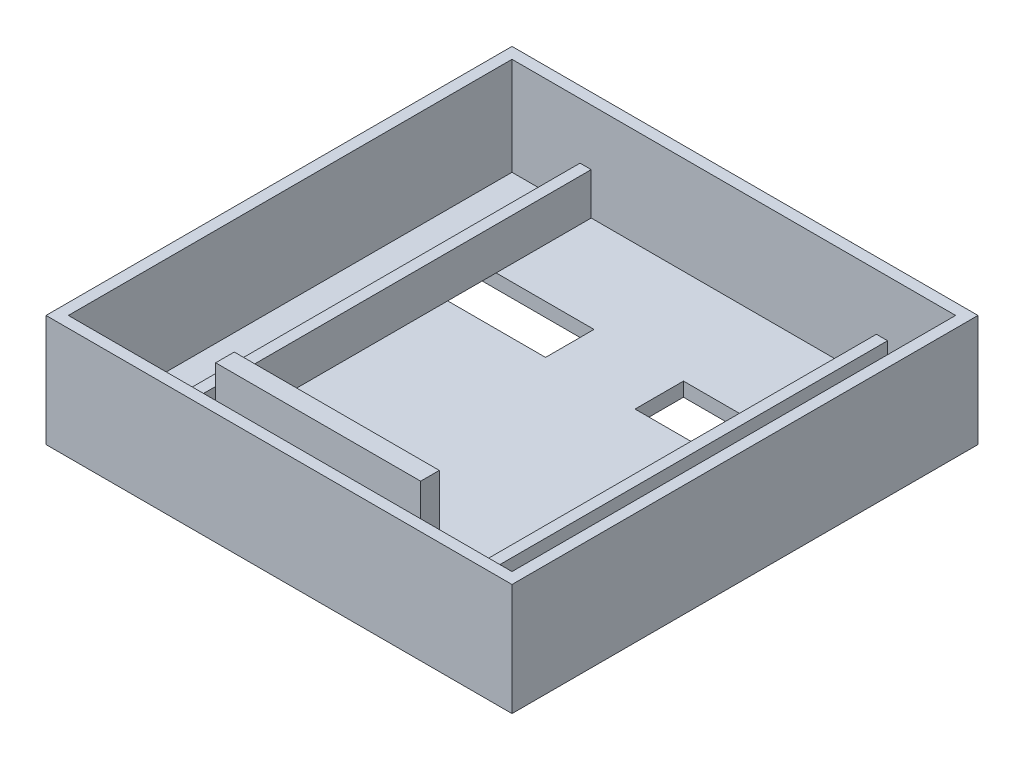
ISO-10303-21;
HEADER;
FILE_DESCRIPTION(('STEP AP214'),'2;1');
FILE_NAME('part.step','',(''),(''),'','','');
FILE_SCHEMA(('AUTOMOTIVE_DESIGN { 1 0 10303 214 1 1 1 1 }'));
ENDSEC;
DATA;
#1=APPLICATION_CONTEXT('core data for automotive mechanical design processes');
#2=APPLICATION_PROTOCOL_DEFINITION('international standard','automotive_design',2000,#1);
#3=PRODUCT_CONTEXT('',#1,'mechanical');
#4=PRODUCT('Part','Part','',(#3));
#5=PRODUCT_RELATED_PRODUCT_CATEGORY('part','',(#4));
#6=PRODUCT_DEFINITION_FORMATION('','',#4);
#7=PRODUCT_DEFINITION_CONTEXT('part definition',#1,'design');
#8=PRODUCT_DEFINITION('design','',#6,#7);
#9=PRODUCT_DEFINITION_SHAPE('','',#8);
#10=(LENGTH_UNIT() NAMED_UNIT(*) SI_UNIT(.MILLI.,.METRE.));
#11=(NAMED_UNIT(*) PLANE_ANGLE_UNIT() SI_UNIT($,.RADIAN.));
#12=(NAMED_UNIT(*) SI_UNIT($,.STERADIAN.) SOLID_ANGLE_UNIT());
#13=UNCERTAINTY_MEASURE_WITH_UNIT(LENGTH_MEASURE(1.E-05),#10,'distance_accuracy_value','');
#14=(GEOMETRIC_REPRESENTATION_CONTEXT(3) GLOBAL_UNCERTAINTY_ASSIGNED_CONTEXT((#13)) GLOBAL_UNIT_ASSIGNED_CONTEXT((#10,
#11,#12)) REPRESENTATION_CONTEXT('',''));
#15=CARTESIAN_POINT('',(0.,0.,0.));
#16=DIRECTION('',(0.,0.,1.));
#17=DIRECTION('',(1.,0.,0.));
#18=AXIS2_PLACEMENT_3D('',#15,#16,#17);
#19=CARTESIAN_POINT('',(2.4,13.,-8.4));
#20=DIRECTION('',(0.,0.,1.));
#21=DIRECTION('',(1.,0.,0.));
#22=AXIS2_PLACEMENT_3D('',#19,#20,#21);
#23=PLANE('',#22);
#24=DIRECTION('',(0.,-1.,0.));
#25=VECTOR('',#24,1.);
#26=CARTESIAN_POINT('',(72.,25.,-8.4));
#27=LINE('',#26,#25);
#28=CARTESIAN_POINT('',(72.,13.,-8.4));
#29=VERTEX_POINT('',#28);
#30=CARTESIAN_POINT('',(72.,3.,-8.4));
#31=VERTEX_POINT('',#30);
#32=EDGE_CURVE('E68',#29,#31,#27,.T.);
#33=ORIENTED_EDGE('',*,*,#32,.F.);
#34=DIRECTION('',(-1.,0.,0.));
#35=VECTOR('',#34,1.);
#36=CARTESIAN_POINT('',(2.4,13.,-8.4));
#37=LINE('',#36,#35);
#38=CARTESIAN_POINT('',(97.6,13.,-8.4));
#39=VERTEX_POINT('',#38);
#40=EDGE_CURVE('E327',#39,#29,#37,.T.);
#41=ORIENTED_EDGE('',*,*,#40,.F.);
#42=DIRECTION('',(0.,-1.,0.));
#43=VECTOR('',#42,1.);
#44=CARTESIAN_POINT('',(97.6,13.,-8.4));
#45=LINE('',#44,#43);
#46=CARTESIAN_POINT('',(97.6,3.,-8.4));
#47=VERTEX_POINT('',#46);
#48=EDGE_CURVE('E340',#39,#47,#45,.T.);
#49=ORIENTED_EDGE('',*,*,#48,.T.);
#50=DIRECTION('',(-1.,0.,0.));
#51=VECTOR('',#50,1.);
#52=CARTESIAN_POINT('',(2.4,3.,-8.4));
#53=LINE('',#52,#51);
#54=CARTESIAN_POINT('',(83.,3.,-8.4));
#55=VERTEX_POINT('',#54);
#56=EDGE_CURVE('E319',#47,#55,#53,.T.);
#57=ORIENTED_EDGE('',*,*,#56,.T.);
#58=DIRECTION('',(0.,1.,0.));
#59=VECTOR('',#58,1.);
#60=CARTESIAN_POINT('',(83.,12.,-8.4));
#61=LINE('',#60,#59);
#62=CARTESIAN_POINT('',(83.,12.,-8.4));
#63=VERTEX_POINT('',#62);
#64=EDGE_CURVE('E355',#55,#63,#61,.T.);
#65=ORIENTED_EDGE('',*,*,#64,.T.);
#66=DIRECTION('',(-1.,0.,0.));
#67=VECTOR('',#66,1.);
#68=CARTESIAN_POINT('',(0.,12.,-8.4));
#69=LINE('',#68,#67);
#70=CARTESIAN_POINT('',(80.6,12.,-8.4));
#71=VERTEX_POINT('',#70);
#72=EDGE_CURVE('E349',#63,#71,#69,.T.);
#73=ORIENTED_EDGE('',*,*,#72,.T.);
#74=DIRECTION('',(0.,-1.,0.));
#75=VECTOR('',#74,1.);
#76=CARTESIAN_POINT('',(80.6,12.,-8.4));
#77=LINE('',#76,#75);
#78=CARTESIAN_POINT('',(80.6,3.,-8.4));
#79=VERTEX_POINT('',#78);
#80=EDGE_CURVE('E360',#71,#79,#77,.T.);
#81=ORIENTED_EDGE('',*,*,#80,.T.);
#82=EDGE_CURVE('E313',#79,#31,#53,.T.);
#83=ORIENTED_EDGE('',*,*,#82,.T.);
#84=EDGE_LOOP('',(#33,#41,#49,#57,#65,#73,#81,#83));
#85=FACE_BOUND('',#84,.T.);
#86=ADVANCED_FACE('F44',(#85),#23,.F.);
#87=CARTESIAN_POINT('',(0.,3.,0.));
#88=DIRECTION('',(0.,-1.,0.));
#89=DIRECTION('',(0.,0.,-1.));
#90=AXIS2_PLACEMENT_3D('',#87,#88,#89);
#91=PLANE('',#90);
#92=DIRECTION('',(0.,0.,1.));
#93=VECTOR('',#92,1.);
#94=CARTESIAN_POINT('',(28.,3.,-8.4));
#95=LINE('',#94,#93);
#96=CARTESIAN_POINT('',(28.,3.,-12.4));
#97=VERTEX_POINT('',#96);
#98=CARTESIAN_POINT('',(28.,3.,-8.4));
#99=VERTEX_POINT('',#98);
#100=EDGE_CURVE('E725',#97,#99,#95,.T.);
#101=ORIENTED_EDGE('',*,*,#100,.F.);
#102=DIRECTION('',(-1.,0.,0.));
#103=VECTOR('',#102,1.);
#104=CARTESIAN_POINT('',(28.,3.,-12.4));
#105=LINE('',#104,#103);
#106=CARTESIAN_POINT('',(72.,3.,-12.4));
#107=VERTEX_POINT('',#106);
#108=EDGE_CURVE('E296',#107,#97,#105,.T.);
#109=ORIENTED_EDGE('',*,*,#108,.F.);
#110=DIRECTION('',(0.,0.,-1.));
#111=VECTOR('',#110,1.);
#112=CARTESIAN_POINT('',(72.,3.,-8.4));
#113=LINE('',#112,#111);
#114=EDGE_CURVE('E706',#31,#107,#113,.T.);
#115=ORIENTED_EDGE('',*,*,#114,.F.);
#116=ORIENTED_EDGE('',*,*,#82,.F.);
#117=DIRECTION('',(0.,0.,1.));
#118=VECTOR('',#117,1.);
#119=CARTESIAN_POINT('',(80.6,3.,-2.4));
#120=LINE('',#119,#118);
#121=CARTESIAN_POINT('',(80.6,3.,-66.7999999999999));
#122=VERTEX_POINT('',#121);
#123=EDGE_CURVE('E409',#122,#79,#120,.T.);
#124=ORIENTED_EDGE('',*,*,#123,.F.);
#125=DIRECTION('',(-1.,0.,0.));
#126=VECTOR('',#125,1.);
#127=CARTESIAN_POINT('',(0.,3.,-66.8));
#128=LINE('',#127,#126);
#129=CARTESIAN_POINT('',(59.6,3.,-66.8));
#130=VERTEX_POINT('',#129);
#131=EDGE_CURVE('E559',#122,#130,#128,.T.);
#132=ORIENTED_EDGE('',*,*,#131,.T.);
#133=DIRECTION('',(0.,0.,-1.));
#134=VECTOR('',#133,1.);
#135=CARTESIAN_POINT('',(59.6,3.,0.));
#136=LINE('',#135,#134);
#137=CARTESIAN_POINT('',(59.6,3.,-77.2));
#138=VERTEX_POINT('',#137);
#139=EDGE_CURVE('E572',#130,#138,#136,.T.);
#140=ORIENTED_EDGE('',*,*,#139,.T.);
#141=DIRECTION('',(1.,0.,0.));
#142=VECTOR('',#141,1.);
#143=CARTESIAN_POINT('',(0.,3.,-77.2));
#144=LINE('',#143,#142);
#145=CARTESIAN_POINT('',(80.6,3.,-77.1999999999999));
#146=VERTEX_POINT('',#145);
#147=EDGE_CURVE('E574',#138,#146,#144,.T.);
#148=ORIENTED_EDGE('',*,*,#147,.T.);
#149=CARTESIAN_POINT('',(80.6,3.,-97.6));
#150=VERTEX_POINT('',#149);
#151=EDGE_CURVE('E405',#150,#146,#120,.T.);
#152=ORIENTED_EDGE('',*,*,#151,.F.);
#153=DIRECTION('',(-1.,0.,0.));
#154=VECTOR('',#153,1.);
#155=CARTESIAN_POINT('',(2.4,3.,-97.6));
#156=LINE('',#155,#154);
#157=CARTESIAN_POINT('',(19.4,3.,-97.6));
#158=VERTEX_POINT('',#157);
#159=EDGE_CURVE('E496',#150,#158,#156,.T.);
#160=ORIENTED_EDGE('',*,*,#159,.T.);
#161=DIRECTION('',(0.,0.,-1.));
#162=VECTOR('',#161,1.);
#163=CARTESIAN_POINT('',(19.4,3.,-2.4));
#164=LINE('',#163,#162);
#165=CARTESIAN_POINT('',(19.4,3.,-77.1999999999999));
#166=VERTEX_POINT('',#165);
#167=EDGE_CURVE('E381',#166,#158,#164,.T.);
#168=ORIENTED_EDGE('',*,*,#167,.F.);
#169=DIRECTION('',(1.,0.,0.));
#170=VECTOR('',#169,1.);
#171=CARTESIAN_POINT('',(0.,3.,-77.2));
#172=LINE('',#171,#170);
#173=CARTESIAN_POINT('',(40.4,3.,-77.2));
#174=VERTEX_POINT('',#173);
#175=EDGE_CURVE('E587',#166,#174,#172,.T.);
#176=ORIENTED_EDGE('',*,*,#175,.T.);
#177=DIRECTION('',(0.,0.,1.));
#178=VECTOR('',#177,1.);
#179=CARTESIAN_POINT('',(40.4,3.,0.));
#180=LINE('',#179,#178);
#181=CARTESIAN_POINT('',(40.4,3.,-66.8));
#182=VERTEX_POINT('',#181);
#183=EDGE_CURVE('E584',#174,#182,#180,.T.);
#184=ORIENTED_EDGE('',*,*,#183,.T.);
#185=DIRECTION('',(-1.,0.,0.));
#186=VECTOR('',#185,1.);
#187=CARTESIAN_POINT('',(0.,3.,-66.8));
#188=LINE('',#187,#186);
#189=CARTESIAN_POINT('',(19.4,3.,-66.7999999999999));
#190=VERTEX_POINT('',#189);
#191=EDGE_CURVE('E583',#182,#190,#188,.T.);
#192=ORIENTED_EDGE('',*,*,#191,.T.);
#193=CARTESIAN_POINT('',(19.4,3.,-8.4));
#194=VERTEX_POINT('',#193);
#195=EDGE_CURVE('E368',#194,#190,#164,.T.);
#196=ORIENTED_EDGE('',*,*,#195,.F.);
#197=EDGE_CURVE('E310',#99,#194,#53,.T.);
#198=ORIENTED_EDGE('',*,*,#197,.F.);
#199=EDGE_LOOP('',(#101,#109,#115,#116,#124,#132,#140,#148,#152,#160,#168,#176,#184,#192,#196,#198));
#200=FACE_BOUND('',#199,.T.);
#201=ADVANCED_FACE('F638',(#200),#91,.F.);
#202=CARTESIAN_POINT('',(17.,3.,-8.4));
#203=VERTEX_POINT('',#202);
#204=CARTESIAN_POINT('',(2.4,3.,-8.4));
#205=VERTEX_POINT('',#204);
#206=EDGE_CURVE('E304',#203,#205,#53,.T.);
#207=ORIENTED_EDGE('',*,*,#206,.F.);
#208=DIRECTION('',(0.,0.,1.));
#209=VECTOR('',#208,1.);
#210=CARTESIAN_POINT('',(17.,3.,-2.4));
#211=LINE('',#210,#209);
#212=CARTESIAN_POINT('',(17.,3.,-66.7999999999999));
#213=VERTEX_POINT('',#212);
#214=EDGE_CURVE('E53',#213,#203,#211,.T.);
#215=ORIENTED_EDGE('',*,*,#214,.F.);
#216=CARTESIAN_POINT('',(14.,3.,-66.8));
#217=VERTEX_POINT('',#216);
#218=EDGE_CURVE('E577',#213,#217,#188,.T.);
#219=ORIENTED_EDGE('',*,*,#218,.T.);
#220=DIRECTION('',(0.,0.,-1.));
#221=VECTOR('',#220,1.);
#222=CARTESIAN_POINT('',(14.,3.,0.));
#223=LINE('',#222,#221);
#224=CARTESIAN_POINT('',(14.,3.,-77.2));
#225=VERTEX_POINT('',#224);
#226=EDGE_CURVE('E592',#217,#225,#223,.T.);
#227=ORIENTED_EDGE('',*,*,#226,.T.);
#228=CARTESIAN_POINT('',(17.,3.,-77.1999999999999));
#229=VERTEX_POINT('',#228);
#230=EDGE_CURVE('E591',#225,#229,#172,.T.);
#231=ORIENTED_EDGE('',*,*,#230,.T.);
#232=CARTESIAN_POINT('',(17.,3.,-97.6));
#233=VERTEX_POINT('',#232);
#234=EDGE_CURVE('E373',#233,#229,#211,.T.);
#235=ORIENTED_EDGE('',*,*,#234,.F.);
#236=CARTESIAN_POINT('',(2.4,3.,-97.6));
#237=VERTEX_POINT('',#236);
#238=EDGE_CURVE('E494',#233,#237,#156,.T.);
#239=ORIENTED_EDGE('',*,*,#238,.T.);
#240=DIRECTION('',(0.,0.,1.));
#241=VECTOR('',#240,1.);
#242=CARTESIAN_POINT('',(2.4,3.,-2.4));
#243=LINE('',#242,#241);
#244=EDGE_CURVE('E471',#237,#205,#243,.T.);
#245=ORIENTED_EDGE('',*,*,#244,.T.);
#246=EDGE_LOOP('',(#207,#215,#219,#227,#231,#235,#239,#245));
#247=FACE_BOUND('',#246,.T.);
#248=ADVANCED_FACE('F647',(#247),#91,.F.);
#249=ORIENTED_EDGE('',*,*,#56,.F.);
#250=DIRECTION('',(0.,0.,-1.));
#251=VECTOR('',#250,1.);
#252=CARTESIAN_POINT('',(97.6,3.,-2.4));
#253=LINE('',#252,#251);
#254=CARTESIAN_POINT('',(97.6,3.,-97.6));
#255=VERTEX_POINT('',#254);
#256=EDGE_CURVE('E495',#47,#255,#253,.T.);
#257=ORIENTED_EDGE('',*,*,#256,.T.);
#258=CARTESIAN_POINT('',(83.,3.,-97.6));
#259=VERTEX_POINT('',#258);
#260=EDGE_CURVE('E476',#255,#259,#156,.T.);
#261=ORIENTED_EDGE('',*,*,#260,.T.);
#262=DIRECTION('',(0.,0.,-1.));
#263=VECTOR('',#262,1.);
#264=CARTESIAN_POINT('',(83.,3.,-2.4));
#265=LINE('',#264,#263);
#266=CARTESIAN_POINT('',(83.,3.,-77.1999999999999));
#267=VERTEX_POINT('',#266);
#268=EDGE_CURVE('E402',#267,#259,#265,.T.);
#269=ORIENTED_EDGE('',*,*,#268,.F.);
#270=CARTESIAN_POINT('',(86.,3.,-77.2));
#271=VERTEX_POINT('',#270);
#272=EDGE_CURVE('E568',#267,#271,#144,.T.);
#273=ORIENTED_EDGE('',*,*,#272,.T.);
#274=DIRECTION('',(0.,0.,1.));
#275=VECTOR('',#274,1.);
#276=CARTESIAN_POINT('',(86.,3.,0.));
#277=LINE('',#276,#275);
#278=CARTESIAN_POINT('',(86.,3.,-66.8));
#279=VERTEX_POINT('',#278);
#280=EDGE_CURVE('E562',#271,#279,#277,.T.);
#281=ORIENTED_EDGE('',*,*,#280,.T.);
#282=CARTESIAN_POINT('',(83.,3.,-66.7999999999999));
#283=VERTEX_POINT('',#282);
#284=EDGE_CURVE('E564',#279,#283,#128,.T.);
#285=ORIENTED_EDGE('',*,*,#284,.T.);
#286=EDGE_CURVE('E399',#55,#283,#265,.T.);
#287=ORIENTED_EDGE('',*,*,#286,.F.);
#288=EDGE_LOOP('',(#249,#257,#261,#269,#273,#281,#285,#287));
#289=FACE_BOUND('',#288,.T.);
#290=ADVANCED_FACE('F614',(#289),#91,.F.);
#291=CARTESIAN_POINT('',(80.6,12.,-2.4));
#292=DIRECTION('',(1.,0.,0.));
#293=DIRECTION('',(0.,0.,-1.));
#294=AXIS2_PLACEMENT_3D('',#291,#292,#293);
#295=PLANE('',#294);
#296=ORIENTED_EDGE('',*,*,#80,.F.);
#297=DIRECTION('',(0.,0.,1.));
#298=VECTOR('',#297,1.);
#299=CARTESIAN_POINT('',(80.6,12.,-2.4));
#300=LINE('',#299,#298);
#301=CARTESIAN_POINT('',(80.6,12.,-97.6));
#302=VERTEX_POINT('',#301);
#303=EDGE_CURVE('E415',#302,#71,#300,.T.);
#304=ORIENTED_EDGE('',*,*,#303,.F.);
#305=DIRECTION('',(0.,-1.,0.));
#306=VECTOR('',#305,1.);
#307=CARTESIAN_POINT('',(80.6,12.,-97.6));
#308=LINE('',#307,#306);
#309=EDGE_CURVE('E395',#302,#150,#308,.T.);
#310=ORIENTED_EDGE('',*,*,#309,.T.);
#311=ORIENTED_EDGE('',*,*,#151,.T.);
#312=EDGE_CURVE('E398',#146,#122,#120,.T.);
#313=ORIENTED_EDGE('',*,*,#312,.T.);
#314=ORIENTED_EDGE('',*,*,#123,.T.);
#315=EDGE_LOOP('',(#296,#304,#310,#311,#313,#314));
#316=FACE_BOUND('',#315,.T.);
#317=ADVANCED_FACE('F627',(#316),#295,.F.);
#318=CARTESIAN_POINT('',(83.,12.,-2.4));
#319=DIRECTION('',(-1.,0.,0.));
#320=DIRECTION('',(0.,0.,1.));
#321=AXIS2_PLACEMENT_3D('',#318,#319,#320);
#322=PLANE('',#321);
#323=ORIENTED_EDGE('',*,*,#64,.F.);
#324=ORIENTED_EDGE('',*,*,#286,.T.);
#325=EDGE_CURVE('E397',#283,#267,#265,.T.);
#326=ORIENTED_EDGE('',*,*,#325,.T.);
#327=ORIENTED_EDGE('',*,*,#268,.T.);
#328=DIRECTION('',(0.,-1.,0.));
#329=VECTOR('',#328,1.);
#330=CARTESIAN_POINT('',(83.,12.,-97.6));
#331=LINE('',#330,#329);
#332=CARTESIAN_POINT('',(83.,12.,-97.6));
#333=VERTEX_POINT('',#332);
#334=EDGE_CURVE('E363',#333,#259,#331,.T.);
#335=ORIENTED_EDGE('',*,*,#334,.F.);
#336=DIRECTION('',(0.,0.,-1.));
#337=VECTOR('',#336,1.);
#338=CARTESIAN_POINT('',(83.,12.,-2.4));
#339=LINE('',#338,#337);
#340=EDGE_CURVE('E408',#63,#333,#339,.T.);
#341=ORIENTED_EDGE('',*,*,#340,.F.);
#342=EDGE_LOOP('',(#323,#324,#326,#327,#335,#341));
#343=FACE_BOUND('',#342,.T.);
#344=ADVANCED_FACE('F606',(#343),#322,.F.);
#345=CARTESIAN_POINT('',(0.,12.,0.));
#346=DIRECTION('',(0.,-1.,0.));
#347=DIRECTION('',(0.,0.,-1.));
#348=AXIS2_PLACEMENT_3D('',#345,#346,#347);
#349=PLANE('',#348);
#350=ORIENTED_EDGE('',*,*,#72,.F.);
#351=ORIENTED_EDGE('',*,*,#340,.T.);
#352=DIRECTION('',(-1.,0.,0.));
#353=VECTOR('',#352,1.);
#354=CARTESIAN_POINT('',(80.6,12.,-97.6));
#355=LINE('',#354,#353);
#356=EDGE_CURVE('E394',#333,#302,#355,.T.);
#357=ORIENTED_EDGE('',*,*,#356,.T.);
#358=ORIENTED_EDGE('',*,*,#303,.T.);
#359=EDGE_LOOP('',(#350,#351,#357,#358));
#360=FACE_BOUND('',#359,.T.);
#361=ADVANCED_FACE('F763',(#360),#349,.F.);
#362=CARTESIAN_POINT('',(17.,12.,-2.4));
#363=DIRECTION('',(1.,0.,0.));
#364=DIRECTION('',(0.,0.,-1.));
#365=AXIS2_PLACEMENT_3D('',#362,#363,#364);
#366=PLANE('',#365);
#367=DIRECTION('',(0.,-1.,0.));
#368=VECTOR('',#367,1.);
#369=CARTESIAN_POINT('',(17.,12.,-8.4));
#370=LINE('',#369,#368);
#371=CARTESIAN_POINT('',(17.,12.,-8.4));
#372=VERTEX_POINT('',#371);
#373=EDGE_CURVE('E342',#372,#203,#370,.T.);
#374=ORIENTED_EDGE('',*,*,#373,.F.);
#375=DIRECTION('',(0.,0.,1.));
#376=VECTOR('',#375,1.);
#377=CARTESIAN_POINT('',(17.,12.,-2.4));
#378=LINE('',#377,#376);
#379=CARTESIAN_POINT('',(17.,12.,-97.6));
#380=VERTEX_POINT('',#379);
#381=EDGE_CURVE('E362',#380,#372,#378,.T.);
#382=ORIENTED_EDGE('',*,*,#381,.F.);
#383=DIRECTION('',(0.,-1.,0.));
#384=VECTOR('',#383,1.);
#385=CARTESIAN_POINT('',(17.,12.,-97.6));
#386=LINE('',#385,#384);
#387=EDGE_CURVE('E375',#380,#233,#386,.T.);
#388=ORIENTED_EDGE('',*,*,#387,.T.);
#389=ORIENTED_EDGE('',*,*,#234,.T.);
#390=EDGE_CURVE('E378',#229,#213,#211,.T.);
#391=ORIENTED_EDGE('',*,*,#390,.T.);
#392=ORIENTED_EDGE('',*,*,#214,.T.);
#393=EDGE_LOOP('',(#374,#382,#388,#389,#391,#392));
#394=FACE_BOUND('',#393,.T.);
#395=ADVANCED_FACE('F675',(#394),#366,.F.);
#396=CARTESIAN_POINT('',(19.4,12.,-2.4));
#397=DIRECTION('',(-1.,0.,0.));
#398=DIRECTION('',(0.,0.,1.));
#399=AXIS2_PLACEMENT_3D('',#396,#397,#398);
#400=PLANE('',#399);
#401=DIRECTION('',(0.,1.,0.));
#402=VECTOR('',#401,1.);
#403=CARTESIAN_POINT('',(19.4,12.,-8.4));
#404=LINE('',#403,#402);
#405=CARTESIAN_POINT('',(19.4,12.,-8.4));
#406=VERTEX_POINT('',#405);
#407=EDGE_CURVE('E344',#194,#406,#404,.T.);
#408=ORIENTED_EDGE('',*,*,#407,.F.);
#409=ORIENTED_EDGE('',*,*,#195,.T.);
#410=EDGE_CURVE('E380',#190,#166,#164,.T.);
#411=ORIENTED_EDGE('',*,*,#410,.T.);
#412=ORIENTED_EDGE('',*,*,#167,.T.);
#413=DIRECTION('',(0.,-1.,0.));
#414=VECTOR('',#413,1.);
#415=CARTESIAN_POINT('',(19.4,12.,-97.6));
#416=LINE('',#415,#414);
#417=CARTESIAN_POINT('',(19.4,12.,-97.6));
#418=VERTEX_POINT('',#417);
#419=EDGE_CURVE('E383',#418,#158,#416,.T.);
#420=ORIENTED_EDGE('',*,*,#419,.F.);
#421=DIRECTION('',(0.,0.,-1.));
#422=VECTOR('',#421,1.);
#423=CARTESIAN_POINT('',(19.4,12.,-2.4));
#424=LINE('',#423,#422);
#425=EDGE_CURVE('E364',#406,#418,#424,.T.);
#426=ORIENTED_EDGE('',*,*,#425,.F.);
#427=EDGE_LOOP('',(#408,#409,#411,#412,#420,#426));
#428=FACE_BOUND('',#427,.T.);
#429=ADVANCED_FACE('F685',(#428),#400,.F.);
#430=CARTESIAN_POINT('',(0.,12.,0.));
#431=DIRECTION('',(0.,-1.,0.));
#432=DIRECTION('',(0.,0.,-1.));
#433=AXIS2_PLACEMENT_3D('',#430,#431,#432);
#434=PLANE('',#433);
#435=DIRECTION('',(-1.,0.,0.));
#436=VECTOR('',#435,1.);
#437=CARTESIAN_POINT('',(0.,12.,-8.4));
#438=LINE('',#437,#436);
#439=EDGE_CURVE('E11',#406,#372,#438,.T.);
#440=ORIENTED_EDGE('',*,*,#439,.F.);
#441=ORIENTED_EDGE('',*,*,#425,.T.);
#442=DIRECTION('',(-1.,0.,0.));
#443=VECTOR('',#442,1.);
#444=CARTESIAN_POINT('',(17.,12.,-97.6));
#445=LINE('',#444,#443);
#446=EDGE_CURVE('E369',#418,#380,#445,.T.);
#447=ORIENTED_EDGE('',*,*,#446,.T.);
#448=ORIENTED_EDGE('',*,*,#381,.T.);
#449=EDGE_LOOP('',(#440,#441,#447,#448));
#450=FACE_BOUND('',#449,.T.);
#451=ADVANCED_FACE('F700',(#450),#434,.F.);
#452=CARTESIAN_POINT('',(0.,3.,0.));
#453=DIRECTION('',(1.,0.,0.));
#454=DIRECTION('',(0.,0.,-1.));
#455=AXIS2_PLACEMENT_3D('',#452,#453,#454);
#456=PLANE('',#455);
#457=DIRECTION('',(0.,0.,1.));
#458=VECTOR('',#457,1.);
#459=CARTESIAN_POINT('',(0.,0.,0.));
#460=LINE('',#459,#458);
#461=CARTESIAN_POINT('',(0.,0.,-100.));
#462=VERTEX_POINT('',#461);
#463=CARTESIAN_POINT('',(0.,0.,0.));
#464=VERTEX_POINT('',#463);
#465=EDGE_CURVE('E533',#462,#464,#460,.T.);
#466=ORIENTED_EDGE('',*,*,#465,.T.);
#467=DIRECTION('',(0.,-1.,0.));
#468=VECTOR('',#467,1.);
#469=CARTESIAN_POINT('',(0.,3.,0.));
#470=LINE('',#469,#468);
#471=CARTESIAN_POINT('',(0.,24.,0.));
#472=VERTEX_POINT('',#471);
#473=EDGE_CURVE('E556',#472,#464,#470,.T.);
#474=ORIENTED_EDGE('',*,*,#473,.F.);
#475=DIRECTION('',(0.,0.,1.));
#476=VECTOR('',#475,1.);
#477=CARTESIAN_POINT('',(0.,24.,0.));
#478=LINE('',#477,#476);
#479=CARTESIAN_POINT('',(0.,24.,-100.));
#480=VERTEX_POINT('',#479);
#481=EDGE_CURVE('E513',#480,#472,#478,.T.);
#482=ORIENTED_EDGE('',*,*,#481,.F.);
#483=DIRECTION('',(0.,-1.,0.));
#484=VECTOR('',#483,1.);
#485=CARTESIAN_POINT('',(0.,3.,-100.));
#486=LINE('',#485,#484);
#487=EDGE_CURVE('E542',#480,#462,#486,.T.);
#488=ORIENTED_EDGE('',*,*,#487,.T.);
#489=EDGE_LOOP('',(#466,#474,#482,#488));
#490=FACE_BOUND('',#489,.T.);
#491=ADVANCED_FACE('F50',(#490),#456,.F.);
#492=CARTESIAN_POINT('',(0.,3.,0.));
#493=DIRECTION('',(0.,0.,-1.));
#494=DIRECTION('',(-1.,0.,0.));
#495=AXIS2_PLACEMENT_3D('',#492,#493,#494);
#496=PLANE('',#495);
#497=DIRECTION('',(1.,0.,0.));
#498=VECTOR('',#497,1.);
#499=CARTESIAN_POINT('',(0.,0.,0.));
#500=LINE('',#499,#498);
#501=CARTESIAN_POINT('',(100.,0.,0.));
#502=VERTEX_POINT('',#501);
#503=EDGE_CURVE('E532',#464,#502,#500,.T.);
#504=ORIENTED_EDGE('',*,*,#503,.T.);
#505=DIRECTION('',(0.,-1.,0.));
#506=VECTOR('',#505,1.);
#507=CARTESIAN_POINT('',(100.,3.,0.));
#508=LINE('',#507,#506);
#509=CARTESIAN_POINT('',(100.,24.,0.));
#510=VERTEX_POINT('',#509);
#511=EDGE_CURVE('E555',#510,#502,#508,.T.);
#512=ORIENTED_EDGE('',*,*,#511,.F.);
#513=DIRECTION('',(1.,0.,0.));
#514=VECTOR('',#513,1.);
#515=CARTESIAN_POINT('',(0.,24.,0.));
#516=LINE('',#515,#514);
#517=EDGE_CURVE('E518',#472,#510,#516,.T.);
#518=ORIENTED_EDGE('',*,*,#517,.F.);
#519=ORIENTED_EDGE('',*,*,#473,.T.);
#520=EDGE_LOOP('',(#504,#512,#518,#519));
#521=FACE_BOUND('',#520,.T.);
#522=ADVANCED_FACE('F819',(#521),#496,.F.);
#523=CARTESIAN_POINT('',(100.,3.,0.));
#524=DIRECTION('',(-1.,0.,0.));
#525=DIRECTION('',(0.,0.,1.));
#526=AXIS2_PLACEMENT_3D('',#523,#524,#525);
#527=PLANE('',#526);
#528=DIRECTION('',(0.,0.,-1.));
#529=VECTOR('',#528,1.);
#530=CARTESIAN_POINT('',(100.,0.,0.));
#531=LINE('',#530,#529);
#532=CARTESIAN_POINT('',(100.,0.,-100.));
#533=VERTEX_POINT('',#532);
#534=EDGE_CURVE('E538',#502,#533,#531,.T.);
#535=ORIENTED_EDGE('',*,*,#534,.T.);
#536=DIRECTION('',(0.,-1.,0.));
#537=VECTOR('',#536,1.);
#538=CARTESIAN_POINT('',(100.,3.,-100.));
#539=LINE('',#538,#537);
#540=CARTESIAN_POINT('',(100.,24.,-100.));
#541=VERTEX_POINT('',#540);
#542=EDGE_CURVE('E547',#541,#533,#539,.T.);
#543=ORIENTED_EDGE('',*,*,#542,.F.);
#544=DIRECTION('',(0.,0.,-1.));
#545=VECTOR('',#544,1.);
#546=CARTESIAN_POINT('',(100.,24.,0.));
#547=LINE('',#546,#545);
#548=EDGE_CURVE('E521',#510,#541,#547,.T.);
#549=ORIENTED_EDGE('',*,*,#548,.F.);
#550=ORIENTED_EDGE('',*,*,#511,.T.);
#551=EDGE_LOOP('',(#535,#543,#549,#550));
#552=FACE_BOUND('',#551,.T.);
#553=ADVANCED_FACE('F820',(#552),#527,.F.);
#554=CARTESIAN_POINT('',(0.,3.,-100.));
#555=DIRECTION('',(0.,0.,1.));
#556=DIRECTION('',(1.,0.,0.));
#557=AXIS2_PLACEMENT_3D('',#554,#555,#556);
#558=PLANE('',#557);
#559=DIRECTION('',(-1.,0.,0.));
#560=VECTOR('',#559,1.);
#561=CARTESIAN_POINT('',(0.,0.,-100.));
#562=LINE('',#561,#560);
#563=EDGE_CURVE('E541',#533,#462,#562,.T.);
#564=ORIENTED_EDGE('',*,*,#563,.T.);
#565=ORIENTED_EDGE('',*,*,#487,.F.);
#566=DIRECTION('',(-1.,0.,0.));
#567=VECTOR('',#566,1.);
#568=CARTESIAN_POINT('',(0.,24.,-100.));
#569=LINE('',#568,#567);
#570=EDGE_CURVE('E527',#541,#480,#569,.T.);
#571=ORIENTED_EDGE('',*,*,#570,.F.);
#572=ORIENTED_EDGE('',*,*,#542,.T.);
#573=EDGE_LOOP('',(#564,#565,#571,#572));
#574=FACE_BOUND('',#573,.T.);
#575=ADVANCED_FACE('F813',(#574),#558,.F.);
#576=CARTESIAN_POINT('',(0.,0.,0.));
#577=DIRECTION('',(0.,-1.,0.));
#578=DIRECTION('',(0.,0.,-1.));
#579=AXIS2_PLACEMENT_3D('',#576,#577,#578);
#580=PLANE('',#579);
#581=DIRECTION('',(0.,0.,-1.));
#582=VECTOR('',#581,1.);
#583=CARTESIAN_POINT('',(14.,0.,0.));
#584=LINE('',#583,#582);
#585=CARTESIAN_POINT('',(14.,0.,-66.8));
#586=VERTEX_POINT('',#585);
#587=CARTESIAN_POINT('',(14.,0.,-77.2));
#588=VERTEX_POINT('',#587);
#589=EDGE_CURVE('E467',#586,#588,#584,.T.);
#590=ORIENTED_EDGE('',*,*,#589,.F.);
#591=DIRECTION('',(-1.,0.,0.));
#592=VECTOR('',#591,1.);
#593=CARTESIAN_POINT('',(0.,0.,-66.8));
#594=LINE('',#593,#592);
#595=CARTESIAN_POINT('',(40.4,0.,-66.8));
#596=VERTEX_POINT('',#595);
#597=EDGE_CURVE('E458',#596,#586,#594,.T.);
#598=ORIENTED_EDGE('',*,*,#597,.F.);
#599=DIRECTION('',(0.,0.,1.));
#600=VECTOR('',#599,1.);
#601=CARTESIAN_POINT('',(40.4,0.,0.));
#602=LINE('',#601,#600);
#603=CARTESIAN_POINT('',(40.4,0.,-77.2));
#604=VERTEX_POINT('',#603);
#605=EDGE_CURVE('E465',#604,#596,#602,.T.);
#606=ORIENTED_EDGE('',*,*,#605,.F.);
#607=DIRECTION('',(1.,0.,0.));
#608=VECTOR('',#607,1.);
#609=CARTESIAN_POINT('',(0.,0.,-77.2));
#610=LINE('',#609,#608);
#611=EDGE_CURVE('E470',#588,#604,#610,.T.);
#612=ORIENTED_EDGE('',*,*,#611,.F.);
#613=EDGE_LOOP('',(#590,#598,#606,#612));
#614=FACE_BOUND('',#613,.T.);
#615=DIRECTION('',(0.,0.,-1.));
#616=VECTOR('',#615,1.);
#617=CARTESIAN_POINT('',(59.6,0.,0.));
#618=LINE('',#617,#616);
#619=CARTESIAN_POINT('',(59.6,0.,-66.8));
#620=VERTEX_POINT('',#619);
#621=CARTESIAN_POINT('',(59.6,0.,-77.2));
#622=VERTEX_POINT('',#621);
#623=EDGE_CURVE('E460',#620,#622,#618,.T.);
#624=ORIENTED_EDGE('',*,*,#623,.F.);
#625=DIRECTION('',(-1.,0.,0.));
#626=VECTOR('',#625,1.);
#627=CARTESIAN_POINT('',(0.,0.,-66.8));
#628=LINE('',#627,#626);
#629=CARTESIAN_POINT('',(86.,0.,-66.8));
#630=VERTEX_POINT('',#629);
#631=EDGE_CURVE('E419',#630,#620,#628,.T.);
#632=ORIENTED_EDGE('',*,*,#631,.F.);
#633=DIRECTION('',(0.,0.,1.));
#634=VECTOR('',#633,1.);
#635=CARTESIAN_POINT('',(86.,0.,0.));
#636=LINE('',#635,#634);
#637=CARTESIAN_POINT('',(86.,0.,-77.2));
#638=VERTEX_POINT('',#637);
#639=EDGE_CURVE('E449',#638,#630,#636,.T.);
#640=ORIENTED_EDGE('',*,*,#639,.F.);
#641=DIRECTION('',(1.,0.,0.));
#642=VECTOR('',#641,1.);
#643=CARTESIAN_POINT('',(0.,0.,-77.2));
#644=LINE('',#643,#642);
#645=EDGE_CURVE('E453',#622,#638,#644,.T.);
#646=ORIENTED_EDGE('',*,*,#645,.F.);
#647=EDGE_LOOP('',(#624,#632,#640,#646));
#648=FACE_BOUND('',#647,.T.);
#649=ORIENTED_EDGE('',*,*,#465,.F.);
#650=ORIENTED_EDGE('',*,*,#563,.F.);
#651=ORIENTED_EDGE('',*,*,#534,.F.);
#652=ORIENTED_EDGE('',*,*,#503,.F.);
#653=EDGE_LOOP('',(#649,#650,#651,#652));
#654=FACE_BOUND('',#653,.T.);
#655=ADVANCED_FACE('F806',(#614,#648,#654),#580,.T.);
#656=CARTESIAN_POINT('',(0.,24.,0.));
#657=DIRECTION('',(0.,-1.,0.));
#658=DIRECTION('',(0.,0.,-1.));
#659=AXIS2_PLACEMENT_3D('',#656,#657,#658);
#660=PLANE('',#659);
#661=ORIENTED_EDGE('',*,*,#481,.T.);
#662=ORIENTED_EDGE('',*,*,#517,.T.);
#663=ORIENTED_EDGE('',*,*,#548,.T.);
#664=ORIENTED_EDGE('',*,*,#570,.T.);
#665=EDGE_LOOP('',(#661,#662,#663,#664));
#666=FACE_BOUND('',#665,.T.);
#667=DIRECTION('',(0.,0.,1.));
#668=VECTOR('',#667,1.);
#669=CARTESIAN_POINT('',(2.4,24.,-2.4));
#670=LINE('',#669,#668);
#671=CARTESIAN_POINT('',(2.4,24.,-97.6));
#672=VERTEX_POINT('',#671);
#673=CARTESIAN_POINT('',(2.4,24.,-2.4));
#674=VERTEX_POINT('',#673);
#675=EDGE_CURVE('E475',#672,#674,#670,.T.);
#676=ORIENTED_EDGE('',*,*,#675,.F.);
#677=DIRECTION('',(-1.,0.,0.));
#678=VECTOR('',#677,1.);
#679=CARTESIAN_POINT('',(2.4,24.,-97.6));
#680=LINE('',#679,#678);
#681=CARTESIAN_POINT('',(97.6,24.,-97.6));
#682=VERTEX_POINT('',#681);
#683=EDGE_CURVE('E484',#682,#672,#680,.T.);
#684=ORIENTED_EDGE('',*,*,#683,.F.);
#685=DIRECTION('',(0.,0.,-1.));
#686=VECTOR('',#685,1.);
#687=CARTESIAN_POINT('',(97.6,24.,-2.4));
#688=LINE('',#687,#686);
#689=CARTESIAN_POINT('',(97.6,24.,-2.4));
#690=VERTEX_POINT('',#689);
#691=EDGE_CURVE('E481',#690,#682,#688,.T.);
#692=ORIENTED_EDGE('',*,*,#691,.F.);
#693=DIRECTION('',(1.,0.,0.));
#694=VECTOR('',#693,1.);
#695=CARTESIAN_POINT('',(2.4,24.,-2.4));
#696=LINE('',#695,#694);
#697=EDGE_CURVE('E480',#674,#690,#696,.T.);
#698=ORIENTED_EDGE('',*,*,#697,.F.);
#699=EDGE_LOOP('',(#676,#684,#692,#698));
#700=FACE_BOUND('',#699,.T.);
#701=ADVANCED_FACE('F657',(#666,#700),#660,.F.);
#702=CARTESIAN_POINT('',(2.4,24.,-2.4));
#703=DIRECTION('',(1.,0.,0.));
#704=DIRECTION('',(0.,0.,-1.));
#705=AXIS2_PLACEMENT_3D('',#702,#703,#704);
#706=PLANE('',#705);
#707=DIRECTION('',(0.,0.,1.));
#708=VECTOR('',#707,1.);
#709=CARTESIAN_POINT('',(2.4,13.,-2.4));
#710=LINE('',#709,#708);
#711=CARTESIAN_POINT('',(2.4,13.,-8.4));
#712=VERTEX_POINT('',#711);
#713=CARTESIAN_POINT('',(2.4,13.,-2.4));
#714=VERTEX_POINT('',#713);
#715=EDGE_CURVE('E312',#712,#714,#710,.T.);
#716=ORIENTED_EDGE('',*,*,#715,.F.);
#717=DIRECTION('',(0.,-1.,0.));
#718=VECTOR('',#717,1.);
#719=CARTESIAN_POINT('',(2.4,13.,-8.4));
#720=LINE('',#719,#718);
#721=EDGE_CURVE('E329',#712,#205,#720,.T.);
#722=ORIENTED_EDGE('',*,*,#721,.T.);
#723=ORIENTED_EDGE('',*,*,#244,.F.);
#724=DIRECTION('',(0.,-1.,0.));
#725=VECTOR('',#724,1.);
#726=CARTESIAN_POINT('',(2.4,24.,-97.6));
#727=LINE('',#726,#725);
#728=EDGE_CURVE('E488',#672,#237,#727,.T.);
#729=ORIENTED_EDGE('',*,*,#728,.F.);
#730=ORIENTED_EDGE('',*,*,#675,.T.);
#731=DIRECTION('',(0.,-1.,0.));
#732=VECTOR('',#731,1.);
#733=CARTESIAN_POINT('',(2.4,24.,-2.4));
#734=LINE('',#733,#732);
#735=EDGE_CURVE('E512',#674,#714,#734,.T.);
#736=ORIENTED_EDGE('',*,*,#735,.T.);
#737=EDGE_LOOP('',(#716,#722,#723,#729,#730,#736));
#738=FACE_BOUND('',#737,.T.);
#739=ADVANCED_FACE('F653',(#738),#706,.T.);
#740=CARTESIAN_POINT('',(2.4,24.,-2.4));
#741=DIRECTION('',(0.,0.,-1.));
#742=DIRECTION('',(-1.,0.,0.));
#743=AXIS2_PLACEMENT_3D('',#740,#741,#742);
#744=PLANE('',#743);
#745=DIRECTION('',(1.,0.,0.));
#746=VECTOR('',#745,1.);
#747=CARTESIAN_POINT('',(2.4,13.,-2.4));
#748=LINE('',#747,#746);
#749=CARTESIAN_POINT('',(97.6,13.,-2.4));
#750=VERTEX_POINT('',#749);
#751=EDGE_CURVE('E317',#714,#750,#748,.T.);
#752=ORIENTED_EDGE('',*,*,#751,.F.);
#753=ORIENTED_EDGE('',*,*,#735,.F.);
#754=ORIENTED_EDGE('',*,*,#697,.T.);
#755=DIRECTION('',(0.,-1.,0.));
#756=VECTOR('',#755,1.);
#757=CARTESIAN_POINT('',(97.6,24.,-2.4));
#758=LINE('',#757,#756);
#759=EDGE_CURVE('E506',#690,#750,#758,.T.);
#760=ORIENTED_EDGE('',*,*,#759,.T.);
#761=EDGE_LOOP('',(#752,#753,#754,#760));
#762=FACE_BOUND('',#761,.T.);
#763=ADVANCED_FACE('F665',(#762),#744,.T.);
#764=CARTESIAN_POINT('',(97.6,24.,-2.4));
#765=DIRECTION('',(-1.,0.,0.));
#766=DIRECTION('',(0.,0.,1.));
#767=AXIS2_PLACEMENT_3D('',#764,#765,#766);
#768=PLANE('',#767);
#769=ORIENTED_EDGE('',*,*,#48,.F.);
#770=DIRECTION('',(0.,0.,-1.));
#771=VECTOR('',#770,1.);
#772=CARTESIAN_POINT('',(97.6,13.,-2.4));
#773=LINE('',#772,#771);
#774=EDGE_CURVE('E322',#750,#39,#773,.T.);
#775=ORIENTED_EDGE('',*,*,#774,.F.);
#776=ORIENTED_EDGE('',*,*,#759,.F.);
#777=ORIENTED_EDGE('',*,*,#691,.T.);
#778=DIRECTION('',(0.,-1.,0.));
#779=VECTOR('',#778,1.);
#780=CARTESIAN_POINT('',(97.6,24.,-97.6));
#781=LINE('',#780,#779);
#782=EDGE_CURVE('E502',#682,#255,#781,.T.);
#783=ORIENTED_EDGE('',*,*,#782,.T.);
#784=ORIENTED_EDGE('',*,*,#256,.F.);
#785=EDGE_LOOP('',(#769,#775,#776,#777,#783,#784));
#786=FACE_BOUND('',#785,.T.);
#787=ADVANCED_FACE('F797',(#786),#768,.T.);
#788=CARTESIAN_POINT('',(2.4,24.,-97.6));
#789=DIRECTION('',(0.,0.,1.));
#790=DIRECTION('',(1.,0.,0.));
#791=AXIS2_PLACEMENT_3D('',#788,#789,#790);
#792=PLANE('',#791);
#793=ORIENTED_EDGE('',*,*,#387,.F.);
#794=ORIENTED_EDGE('',*,*,#446,.F.);
#795=ORIENTED_EDGE('',*,*,#419,.T.);
#796=ORIENTED_EDGE('',*,*,#159,.F.);
#797=ORIENTED_EDGE('',*,*,#309,.F.);
#798=ORIENTED_EDGE('',*,*,#356,.F.);
#799=ORIENTED_EDGE('',*,*,#334,.T.);
#800=ORIENTED_EDGE('',*,*,#260,.F.);
#801=ORIENTED_EDGE('',*,*,#782,.F.);
#802=ORIENTED_EDGE('',*,*,#683,.T.);
#803=ORIENTED_EDGE('',*,*,#728,.T.);
#804=ORIENTED_EDGE('',*,*,#238,.F.);
#805=EDGE_LOOP('',(#793,#794,#795,#796,#797,#798,#799,#800,#801,#802,#803,#804));
#806=FACE_BOUND('',#805,.T.);
#807=ADVANCED_FACE('F639',(#806),#792,.T.);
#808=CARTESIAN_POINT('',(59.6,-5.1,-66.8));
#809=DIRECTION('',(-1.,0.,0.));
#810=DIRECTION('',(0.,0.,1.));
#811=AXIS2_PLACEMENT_3D('',#808,#809,#810);
#812=PLANE('',#811);
#813=ORIENTED_EDGE('',*,*,#623,.T.);
#814=DIRECTION('',(0.,1.,0.));
#815=VECTOR('',#814,1.);
#816=CARTESIAN_POINT('',(59.6,-5.1,-77.2));
#817=LINE('',#816,#815);
#818=EDGE_CURVE('E389',#622,#138,#817,.T.);
#819=ORIENTED_EDGE('',*,*,#818,.T.);
#820=ORIENTED_EDGE('',*,*,#139,.F.);
#821=DIRECTION('',(0.,1.,0.));
#822=VECTOR('',#821,1.);
#823=CARTESIAN_POINT('',(59.6,-5.1,-66.8));
#824=LINE('',#823,#822);
#825=EDGE_CURVE('E433',#620,#130,#824,.T.);
#826=ORIENTED_EDGE('',*,*,#825,.F.);
#827=EDGE_LOOP('',(#813,#819,#820,#826));
#828=FACE_BOUND('',#827,.T.);
#829=ADVANCED_FACE('F782',(#828),#812,.F.);
#830=CARTESIAN_POINT('',(59.6,-5.1,-77.2));
#831=DIRECTION('',(0.,0.,-1.));
#832=DIRECTION('',(-1.,0.,0.));
#833=AXIS2_PLACEMENT_3D('',#830,#831,#832);
#834=PLANE('',#833);
#835=ORIENTED_EDGE('',*,*,#645,.T.);
#836=DIRECTION('',(0.,1.,0.));
#837=VECTOR('',#836,1.);
#838=CARTESIAN_POINT('',(86.,-5.1,-77.2));
#839=LINE('',#838,#837);
#840=EDGE_CURVE('E442',#638,#271,#839,.T.);
#841=ORIENTED_EDGE('',*,*,#840,.T.);
#842=ORIENTED_EDGE('',*,*,#272,.F.);
#843=EDGE_CURVE('E578',#146,#267,#144,.T.);
#844=ORIENTED_EDGE('',*,*,#843,.F.);
#845=ORIENTED_EDGE('',*,*,#147,.F.);
#846=ORIENTED_EDGE('',*,*,#818,.F.);
#847=EDGE_LOOP('',(#835,#841,#842,#844,#845,#846));
#848=FACE_BOUND('',#847,.T.);
#849=ADVANCED_FACE('F617',(#848),#834,.F.);
#850=CARTESIAN_POINT('',(86.,-5.1,-66.8));
#851=DIRECTION('',(1.,0.,0.));
#852=DIRECTION('',(0.,0.,-1.));
#853=AXIS2_PLACEMENT_3D('',#850,#851,#852);
#854=PLANE('',#853);
#855=ORIENTED_EDGE('',*,*,#639,.T.);
#856=DIRECTION('',(0.,1.,0.));
#857=VECTOR('',#856,1.);
#858=CARTESIAN_POINT('',(86.,-5.1,-66.8));
#859=LINE('',#858,#857);
#860=EDGE_CURVE('E440',#630,#279,#859,.T.);
#861=ORIENTED_EDGE('',*,*,#860,.T.);
#862=ORIENTED_EDGE('',*,*,#280,.F.);
#863=ORIENTED_EDGE('',*,*,#840,.F.);
#864=EDGE_LOOP('',(#855,#861,#862,#863));
#865=FACE_BOUND('',#864,.T.);
#866=ADVANCED_FACE('F794',(#865),#854,.F.);
#867=CARTESIAN_POINT('',(59.6,-5.1,-66.8));
#868=DIRECTION('',(0.,0.,1.));
#869=DIRECTION('',(1.,0.,0.));
#870=AXIS2_PLACEMENT_3D('',#867,#868,#869);
#871=PLANE('',#870);
#872=ORIENTED_EDGE('',*,*,#631,.T.);
#873=ORIENTED_EDGE('',*,*,#825,.T.);
#874=ORIENTED_EDGE('',*,*,#131,.F.);
#875=EDGE_CURVE('E567',#283,#122,#128,.T.);
#876=ORIENTED_EDGE('',*,*,#875,.F.);
#877=ORIENTED_EDGE('',*,*,#284,.F.);
#878=ORIENTED_EDGE('',*,*,#860,.F.);
#879=EDGE_LOOP('',(#872,#873,#874,#876,#877,#878));
#880=FACE_BOUND('',#879,.T.);
#881=ADVANCED_FACE('F785',(#880),#871,.F.);
#882=CARTESIAN_POINT('',(14.,-5.1,-66.8));
#883=DIRECTION('',(-1.,0.,0.));
#884=DIRECTION('',(0.,0.,1.));
#885=AXIS2_PLACEMENT_3D('',#882,#883,#884);
#886=PLANE('',#885);
#887=ORIENTED_EDGE('',*,*,#589,.T.);
#888=DIRECTION('',(0.,1.,0.));
#889=VECTOR('',#888,1.);
#890=CARTESIAN_POINT('',(14.,-5.1,-77.2));
#891=LINE('',#890,#889);
#892=EDGE_CURVE('E418',#588,#225,#891,.T.);
#893=ORIENTED_EDGE('',*,*,#892,.T.);
#894=ORIENTED_EDGE('',*,*,#226,.F.);
#895=DIRECTION('',(0.,1.,0.));
#896=VECTOR('',#895,1.);
#897=CARTESIAN_POINT('',(14.,-5.1,-66.8));
#898=LINE('',#897,#896);
#899=EDGE_CURVE('E427',#586,#217,#898,.T.);
#900=ORIENTED_EDGE('',*,*,#899,.F.);
#901=EDGE_LOOP('',(#887,#893,#894,#900));
#902=FACE_BOUND('',#901,.T.);
#903=ADVANCED_FACE('F771',(#902),#886,.F.);
#904=CARTESIAN_POINT('',(14.,-5.1,-77.2));
#905=DIRECTION('',(0.,0.,-1.));
#906=DIRECTION('',(-1.,0.,0.));
#907=AXIS2_PLACEMENT_3D('',#904,#905,#906);
#908=PLANE('',#907);
#909=ORIENTED_EDGE('',*,*,#611,.T.);
#910=DIRECTION('',(0.,1.,0.));
#911=VECTOR('',#910,1.);
#912=CARTESIAN_POINT('',(40.4,-5.1,-77.2));
#913=LINE('',#912,#911);
#914=EDGE_CURVE('E423',#604,#174,#913,.T.);
#915=ORIENTED_EDGE('',*,*,#914,.T.);
#916=ORIENTED_EDGE('',*,*,#175,.F.);
#917=EDGE_CURVE('E594',#229,#166,#172,.T.);
#918=ORIENTED_EDGE('',*,*,#917,.F.);
#919=ORIENTED_EDGE('',*,*,#230,.F.);
#920=ORIENTED_EDGE('',*,*,#892,.F.);
#921=EDGE_LOOP('',(#909,#915,#916,#918,#919,#920));
#922=FACE_BOUND('',#921,.T.);
#923=ADVANCED_FACE('F693',(#922),#908,.F.);
#924=CARTESIAN_POINT('',(40.4,-5.1,-66.8));
#925=DIRECTION('',(1.,0.,0.));
#926=DIRECTION('',(0.,0.,-1.));
#927=AXIS2_PLACEMENT_3D('',#924,#925,#926);
#928=PLANE('',#927);
#929=ORIENTED_EDGE('',*,*,#605,.T.);
#930=DIRECTION('',(0.,1.,0.));
#931=VECTOR('',#930,1.);
#932=CARTESIAN_POINT('',(40.4,-5.1,-66.8));
#933=LINE('',#932,#931);
#934=EDGE_CURVE('E422',#596,#182,#933,.T.);
#935=ORIENTED_EDGE('',*,*,#934,.T.);
#936=ORIENTED_EDGE('',*,*,#183,.F.);
#937=ORIENTED_EDGE('',*,*,#914,.F.);
#938=EDGE_LOOP('',(#929,#935,#936,#937));
#939=FACE_BOUND('',#938,.T.);
#940=ADVANCED_FACE('F774',(#939),#928,.F.);
#941=CARTESIAN_POINT('',(14.,-5.1,-66.8));
#942=DIRECTION('',(0.,0.,1.));
#943=DIRECTION('',(1.,0.,0.));
#944=AXIS2_PLACEMENT_3D('',#941,#942,#943);
#945=PLANE('',#944);
#946=ORIENTED_EDGE('',*,*,#597,.T.);
#947=ORIENTED_EDGE('',*,*,#899,.T.);
#948=ORIENTED_EDGE('',*,*,#218,.F.);
#949=EDGE_CURVE('E588',#190,#213,#188,.T.);
#950=ORIENTED_EDGE('',*,*,#949,.F.);
#951=ORIENTED_EDGE('',*,*,#191,.F.);
#952=ORIENTED_EDGE('',*,*,#934,.F.);
#953=EDGE_LOOP('',(#946,#947,#948,#950,#951,#952));
#954=FACE_BOUND('',#953,.T.);
#955=ADVANCED_FACE('F756',(#954),#945,.F.);
#956=CARTESIAN_POINT('',(0.,3.,0.));
#957=DIRECTION('',(0.,-1.,0.));
#958=DIRECTION('',(0.,0.,-1.));
#959=AXIS2_PLACEMENT_3D('',#956,#957,#958);
#960=PLANE('',#959);
#961=ORIENTED_EDGE('',*,*,#325,.F.);
#962=ORIENTED_EDGE('',*,*,#875,.T.);
#963=ORIENTED_EDGE('',*,*,#312,.F.);
#964=ORIENTED_EDGE('',*,*,#843,.T.);
#965=EDGE_LOOP('',(#961,#962,#963,#964));
#966=FACE_BOUND('',#965,.T.);
#967=ADVANCED_FACE('F624',(#966),#960,.T.);
#968=CARTESIAN_POINT('',(0.,3.,0.));
#969=DIRECTION('',(0.,-1.,0.));
#970=DIRECTION('',(0.,0.,-1.));
#971=AXIS2_PLACEMENT_3D('',#968,#969,#970);
#972=PLANE('',#971);
#973=ORIENTED_EDGE('',*,*,#410,.F.);
#974=ORIENTED_EDGE('',*,*,#949,.T.);
#975=ORIENTED_EDGE('',*,*,#390,.F.);
#976=ORIENTED_EDGE('',*,*,#917,.T.);
#977=EDGE_LOOP('',(#973,#974,#975,#976));
#978=FACE_BOUND('',#977,.T.);
#979=ADVANCED_FACE('F694',(#978),#972,.T.);
#980=CARTESIAN_POINT('',(28.,13.,-8.4));
#981=VERTEX_POINT('',#980);
#982=EDGE_CURVE('E61',#981,#712,#37,.T.);
#983=ORIENTED_EDGE('',*,*,#982,.F.);
#984=DIRECTION('',(0.,-1.,0.));
#985=VECTOR('',#984,1.);
#986=CARTESIAN_POINT('',(28.,25.,-8.4));
#987=LINE('',#986,#985);
#988=EDGE_CURVE('E305',#981,#99,#987,.T.);
#989=ORIENTED_EDGE('',*,*,#988,.T.);
#990=ORIENTED_EDGE('',*,*,#197,.T.);
#991=ORIENTED_EDGE('',*,*,#407,.T.);
#992=ORIENTED_EDGE('',*,*,#439,.T.);
#993=ORIENTED_EDGE('',*,*,#373,.T.);
#994=ORIENTED_EDGE('',*,*,#206,.T.);
#995=ORIENTED_EDGE('',*,*,#721,.F.);
#996=EDGE_LOOP('',(#983,#989,#990,#991,#992,#993,#994,#995));
#997=FACE_BOUND('',#996,.T.);
#998=ADVANCED_FACE('F666',(#997),#23,.F.);
#999=CARTESIAN_POINT('',(0.,13.,0.));
#1000=DIRECTION('',(0.,-1.,0.));
#1001=DIRECTION('',(0.,0.,-1.));
#1002=AXIS2_PLACEMENT_3D('',#999,#1000,#1001);
#1003=PLANE('',#1002);
#1004=ORIENTED_EDGE('',*,*,#715,.T.);
#1005=ORIENTED_EDGE('',*,*,#751,.T.);
#1006=ORIENTED_EDGE('',*,*,#774,.T.);
#1007=ORIENTED_EDGE('',*,*,#40,.T.);
#1008=EDGE_CURVE('E332',#29,#981,#37,.T.);
#1009=ORIENTED_EDGE('',*,*,#1008,.T.);
#1010=ORIENTED_EDGE('',*,*,#982,.T.);
#1011=EDGE_LOOP('',(#1004,#1005,#1006,#1007,#1009,#1010));
#1012=FACE_BOUND('',#1011,.T.);
#1013=ADVANCED_FACE('F663',(#1012),#1003,.F.);
#1014=CARTESIAN_POINT('',(28.,25.,-8.4));
#1015=DIRECTION('',(1.,0.,0.));
#1016=DIRECTION('',(0.,0.,-1.));
#1017=AXIS2_PLACEMENT_3D('',#1014,#1015,#1016);
#1018=PLANE('',#1017);
#1019=ORIENTED_EDGE('',*,*,#100,.T.);
#1020=ORIENTED_EDGE('',*,*,#988,.F.);
#1021=CARTESIAN_POINT('',(28.,25.,-8.4));
#1022=VERTEX_POINT('',#1021);
#1023=EDGE_CURVE('E278',#1022,#981,#987,.T.);
#1024=ORIENTED_EDGE('',*,*,#1023,.F.);
#1025=DIRECTION('',(0.,0.,1.));
#1026=VECTOR('',#1025,1.);
#1027=CARTESIAN_POINT('',(28.,25.,-8.4));
#1028=LINE('',#1027,#1026);
#1029=CARTESIAN_POINT('',(28.,25.,-12.4));
#1030=VERTEX_POINT('',#1029);
#1031=EDGE_CURVE('E286',#1030,#1022,#1028,.T.);
#1032=ORIENTED_EDGE('',*,*,#1031,.F.);
#1033=DIRECTION('',(0.,-1.,0.));
#1034=VECTOR('',#1033,1.);
#1035=CARTESIAN_POINT('',(28.,25.,-12.4));
#1036=LINE('',#1035,#1034);
#1037=EDGE_CURVE('E715',#1030,#97,#1036,.T.);
#1038=ORIENTED_EDGE('',*,*,#1037,.T.);
#1039=EDGE_LOOP('',(#1019,#1020,#1024,#1032,#1038));
#1040=FACE_BOUND('',#1039,.T.);
#1041=ADVANCED_FACE('F303',(#1040),#1018,.F.);
#1042=CARTESIAN_POINT('',(28.,25.,-8.4));
#1043=DIRECTION('',(0.,0.,-1.));
#1044=DIRECTION('',(-1.,0.,0.));
#1045=AXIS2_PLACEMENT_3D('',#1042,#1043,#1044);
#1046=PLANE('',#1045);
#1047=ORIENTED_EDGE('',*,*,#1008,.F.);
#1048=CARTESIAN_POINT('',(72.,25.,-8.4));
#1049=VERTEX_POINT('',#1048);
#1050=EDGE_CURVE('E285',#1049,#29,#27,.T.);
#1051=ORIENTED_EDGE('',*,*,#1050,.F.);
#1052=DIRECTION('',(1.,0.,0.));
#1053=VECTOR('',#1052,1.);
#1054=CARTESIAN_POINT('',(28.,25.,-8.4));
#1055=LINE('',#1054,#1053);
#1056=EDGE_CURVE('E274',#1022,#1049,#1055,.T.);
#1057=ORIENTED_EDGE('',*,*,#1056,.F.);
#1058=ORIENTED_EDGE('',*,*,#1023,.T.);
#1059=EDGE_LOOP('',(#1047,#1051,#1057,#1058));
#1060=FACE_BOUND('',#1059,.T.);
#1061=ADVANCED_FACE('F279',(#1060),#1046,.F.);
#1062=CARTESIAN_POINT('',(72.,25.,-8.4));
#1063=DIRECTION('',(-1.,0.,0.));
#1064=DIRECTION('',(0.,0.,1.));
#1065=AXIS2_PLACEMENT_3D('',#1062,#1063,#1064);
#1066=PLANE('',#1065);
#1067=ORIENTED_EDGE('',*,*,#114,.T.);
#1068=DIRECTION('',(0.,-1.,0.));
#1069=VECTOR('',#1068,1.);
#1070=CARTESIAN_POINT('',(72.,25.,-12.4));
#1071=LINE('',#1070,#1069);
#1072=CARTESIAN_POINT('',(72.,25.,-12.4));
#1073=VERTEX_POINT('',#1072);
#1074=EDGE_CURVE('E707',#1073,#107,#1071,.T.);
#1075=ORIENTED_EDGE('',*,*,#1074,.F.);
#1076=DIRECTION('',(0.,0.,-1.));
#1077=VECTOR('',#1076,1.);
#1078=CARTESIAN_POINT('',(72.,25.,-8.4));
#1079=LINE('',#1078,#1077);
#1080=EDGE_CURVE('E289',#1049,#1073,#1079,.T.);
#1081=ORIENTED_EDGE('',*,*,#1080,.F.);
#1082=ORIENTED_EDGE('',*,*,#1050,.T.);
#1083=ORIENTED_EDGE('',*,*,#32,.T.);
#1084=EDGE_LOOP('',(#1067,#1075,#1081,#1082,#1083));
#1085=FACE_BOUND('',#1084,.T.);
#1086=ADVANCED_FACE('F702',(#1085),#1066,.F.);
#1087=CARTESIAN_POINT('',(28.,25.,-12.4));
#1088=DIRECTION('',(0.,0.,1.));
#1089=DIRECTION('',(1.,0.,0.));
#1090=AXIS2_PLACEMENT_3D('',#1087,#1088,#1089);
#1091=PLANE('',#1090);
#1092=ORIENTED_EDGE('',*,*,#108,.T.);
#1093=ORIENTED_EDGE('',*,*,#1037,.F.);
#1094=DIRECTION('',(-1.,0.,0.));
#1095=VECTOR('',#1094,1.);
#1096=CARTESIAN_POINT('',(28.,25.,-12.4));
#1097=LINE('',#1096,#1095);
#1098=EDGE_CURVE('E295',#1073,#1030,#1097,.T.);
#1099=ORIENTED_EDGE('',*,*,#1098,.F.);
#1100=ORIENTED_EDGE('',*,*,#1074,.T.);
#1101=EDGE_LOOP('',(#1092,#1093,#1099,#1100));
#1102=FACE_BOUND('',#1101,.T.);
#1103=ADVANCED_FACE('F730',(#1102),#1091,.F.);
#1104=CARTESIAN_POINT('',(0.,25.,0.));
#1105=DIRECTION('',(0.,-1.,0.));
#1106=DIRECTION('',(0.,0.,-1.));
#1107=AXIS2_PLACEMENT_3D('',#1104,#1105,#1106);
#1108=PLANE('',#1107);
#1109=ORIENTED_EDGE('',*,*,#1031,.T.);
#1110=ORIENTED_EDGE('',*,*,#1056,.T.);
#1111=ORIENTED_EDGE('',*,*,#1080,.T.);
#1112=ORIENTED_EDGE('',*,*,#1098,.T.);
#1113=EDGE_LOOP('',(#1109,#1110,#1111,#1112));
#1114=FACE_BOUND('',#1113,.T.);
#1115=ADVANCED_FACE('F287',(#1114),#1108,.F.);
#1116=CLOSED_SHELL('',(#86,#201,#248,#290,#317,#344,#361,#395,#429,#451,#491,#522,#553,#575,
#655,#701,#739,#763,#787,#807,#829,#849,#866,#881,#903,#923,#940,#955,#967,#979,#998,#1013,
#1041,#1061,#1086,#1103,#1115));
#1117=MANIFOLD_SOLID_BREP('B2',#1116);
#1118=ADVANCED_BREP_SHAPE_REPRESENTATION('',(#18,#1117),#14);
#1119=SHAPE_DEFINITION_REPRESENTATION(#9,#1118);
ENDSEC;
END-ISO-10303-21;
